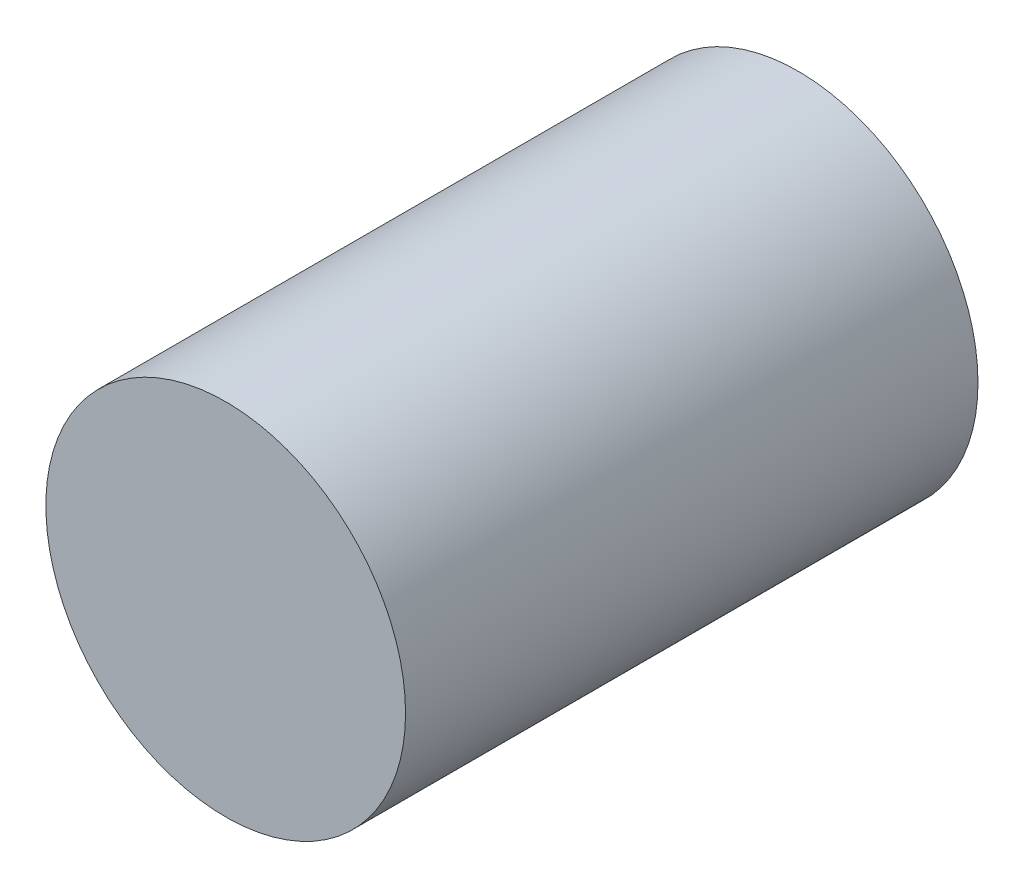
ISO-10303-21;
HEADER;
FILE_DESCRIPTION(('STEP AP214'),'2;1');
FILE_NAME('part.step','',(''),(''),'','','');
FILE_SCHEMA(('AUTOMOTIVE_DESIGN { 1 0 10303 214 1 1 1 1 }'));
ENDSEC;
DATA;
#1=APPLICATION_CONTEXT('core data for automotive mechanical design processes');
#2=APPLICATION_PROTOCOL_DEFINITION('international standard','automotive_design',2000,#1);
#3=PRODUCT_CONTEXT('',#1,'mechanical');
#4=PRODUCT('Part','Part','',(#3));
#5=PRODUCT_RELATED_PRODUCT_CATEGORY('part','',(#4));
#6=PRODUCT_DEFINITION_FORMATION('','',#4);
#7=PRODUCT_DEFINITION_CONTEXT('part definition',#1,'design');
#8=PRODUCT_DEFINITION('design','',#6,#7);
#9=PRODUCT_DEFINITION_SHAPE('','',#8);
#10=(LENGTH_UNIT() NAMED_UNIT(*) SI_UNIT(.MILLI.,.METRE.));
#11=(NAMED_UNIT(*) PLANE_ANGLE_UNIT() SI_UNIT($,.RADIAN.));
#12=(NAMED_UNIT(*) SI_UNIT($,.STERADIAN.) SOLID_ANGLE_UNIT());
#13=UNCERTAINTY_MEASURE_WITH_UNIT(LENGTH_MEASURE(1.E-05),#10,'distance_accuracy_value','');
#14=(GEOMETRIC_REPRESENTATION_CONTEXT(3) GLOBAL_UNCERTAINTY_ASSIGNED_CONTEXT((#13)) GLOBAL_UNIT_ASSIGNED_CONTEXT((#10,
#11,#12)) REPRESENTATION_CONTEXT('',''));
#15=CARTESIAN_POINT('',(0.,0.,0.));
#16=DIRECTION('',(0.,0.,1.));
#17=DIRECTION('',(1.,0.,0.));
#18=AXIS2_PLACEMENT_3D('',#15,#16,#17);
#19=CARTESIAN_POINT('',(0.,-1.39699999999999,85.2932));
#20=DIRECTION('',(0.,0.,-1.));
#21=DIRECTION('',(-1.,0.,0.));
#22=AXIS2_PLACEMENT_3D('',#19,#20,#21);
#23=PLANE('',#22);
#24=CARTESIAN_POINT('',(0.,-1.39699999999999,85.2932));
#25=DIRECTION('',(0.,0.,1.));
#26=DIRECTION('',(1.,0.,0.));
#27=AXIS2_PLACEMENT_3D('',#24,#25,#26);
#28=CIRCLE('',#27,26.797);
#29=CARTESIAN_POINT('',(26.797,-1.39699999999999,85.2932));
#30=VERTEX_POINT('',#29);
#31=EDGE_CURVE('E18',#30,#30,#28,.F.);
#32=ORIENTED_EDGE('',*,*,#31,.F.);
#33=EDGE_LOOP('',(#32));
#34=FACE_BOUND('',#33,.T.);
#35=ADVANCED_FACE('F15',(#34),#23,.F.);
#36=CARTESIAN_POINT('',(0.,-1.39699999999999,0.));
#37=DIRECTION('',(0.,0.,-1.));
#38=DIRECTION('',(-1.,0.,0.));
#39=AXIS2_PLACEMENT_3D('',#36,#37,#38);
#40=PLANE('',#39);
#41=CARTESIAN_POINT('',(0.,-1.39699999999999,0.));
#42=DIRECTION('',(0.,0.,1.));
#43=DIRECTION('',(1.,0.,0.));
#44=AXIS2_PLACEMENT_3D('',#41,#42,#43);
#45=CIRCLE('',#44,26.797);
#46=CARTESIAN_POINT('',(26.797,-1.39699999999999,0.));
#47=VERTEX_POINT('',#46);
#48=EDGE_CURVE('E10',#47,#47,#45,.T.);
#49=ORIENTED_EDGE('',*,*,#48,.F.);
#50=EDGE_LOOP('',(#49));
#51=FACE_BOUND('',#50,.T.);
#52=ADVANCED_FACE('F30',(#51),#40,.T.);
#53=CARTESIAN_POINT('',(0.,-1.39699999999999,0.));
#54=DIRECTION('',(0.,0.,1.));
#55=DIRECTION('',(1.,0.,0.));
#56=AXIS2_PLACEMENT_3D('',#53,#54,#55);
#57=CYLINDRICAL_SURFACE('',#56,26.797);
#58=ORIENTED_EDGE('',*,*,#48,.T.);
#59=EDGE_LOOP('',(#58));
#60=FACE_BOUND('',#59,.T.);
#61=ORIENTED_EDGE('',*,*,#31,.T.);
#62=EDGE_LOOP('',(#61));
#63=FACE_BOUND('',#62,.T.);
#64=ADVANCED_FACE('F27',(#60,#63),#57,.T.);
#65=CLOSED_SHELL('',(#35,#52,#64));
#66=MANIFOLD_SOLID_BREP('B1',#65);
#67=ADVANCED_BREP_SHAPE_REPRESENTATION('',(#18,#66),#14);
#68=SHAPE_DEFINITION_REPRESENTATION(#9,#67);
ENDSEC;
END-ISO-10303-21;
